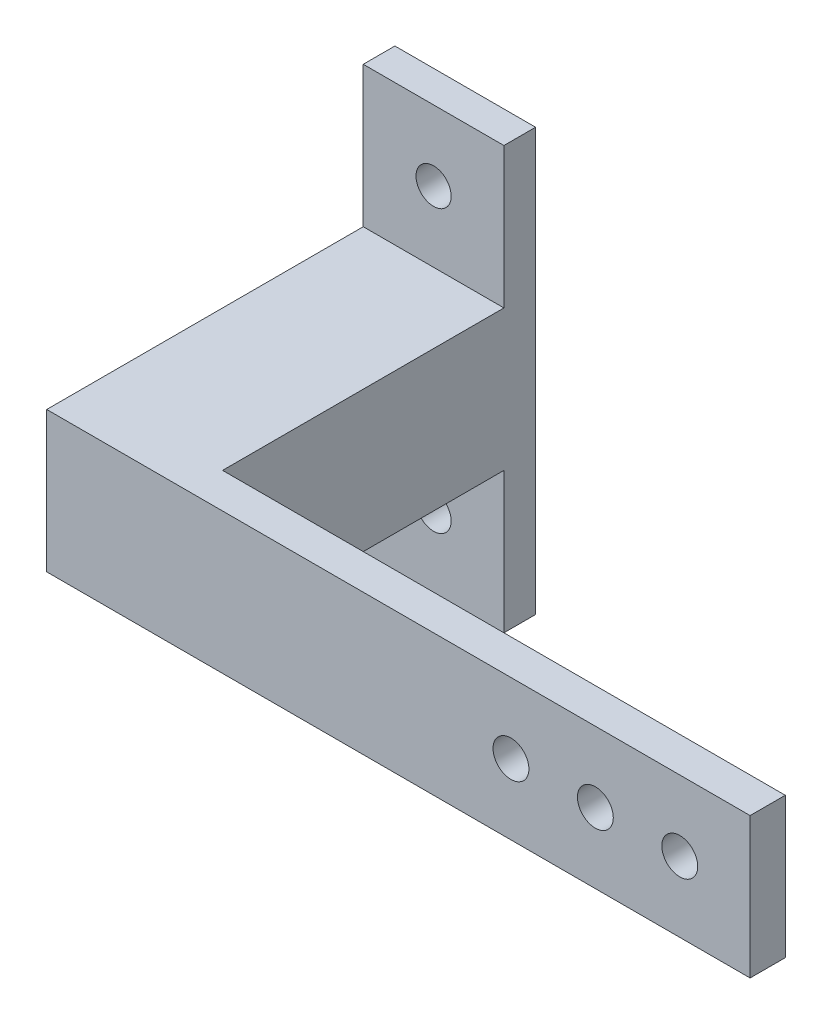
ISO-10303-21;
HEADER;
FILE_DESCRIPTION(('STEP AP214'),'2;1');
FILE_NAME('part.step','',(''),(''),'','','');
FILE_SCHEMA(('AUTOMOTIVE_DESIGN { 1 0 10303 214 1 1 1 1 }'));
ENDSEC;
DATA;
#1=APPLICATION_CONTEXT('core data for automotive mechanical design processes');
#2=APPLICATION_PROTOCOL_DEFINITION('international standard','automotive_design',2000,#1);
#3=PRODUCT_CONTEXT('',#1,'mechanical');
#4=PRODUCT('Part','Part','',(#3));
#5=PRODUCT_RELATED_PRODUCT_CATEGORY('part','',(#4));
#6=PRODUCT_DEFINITION_FORMATION('','',#4);
#7=PRODUCT_DEFINITION_CONTEXT('part definition',#1,'design');
#8=PRODUCT_DEFINITION('design','',#6,#7);
#9=PRODUCT_DEFINITION_SHAPE('','',#8);
#10=(LENGTH_UNIT() NAMED_UNIT(*) SI_UNIT(.MILLI.,.METRE.));
#11=(NAMED_UNIT(*) PLANE_ANGLE_UNIT() SI_UNIT($,.RADIAN.));
#12=(NAMED_UNIT(*) SI_UNIT($,.STERADIAN.) SOLID_ANGLE_UNIT());
#13=UNCERTAINTY_MEASURE_WITH_UNIT(LENGTH_MEASURE(1.E-05),#10,'distance_accuracy_value','');
#14=(GEOMETRIC_REPRESENTATION_CONTEXT(3) GLOBAL_UNCERTAINTY_ASSIGNED_CONTEXT((#13)) GLOBAL_UNIT_ASSIGNED_CONTEXT((#10,
#11,#12)) REPRESENTATION_CONTEXT('',''));
#15=CARTESIAN_POINT('',(0.,0.,0.));
#16=DIRECTION('',(0.,0.,1.));
#17=DIRECTION('',(1.,0.,0.));
#18=AXIS2_PLACEMENT_3D('',#15,#16,#17);
#19=CARTESIAN_POINT('',(0.,0.,4.5));
#20=DIRECTION('',(0.,0.,1.));
#21=DIRECTION('',(1.,0.,0.));
#22=AXIS2_PLACEMENT_3D('',#19,#20,#21);
#23=PLANE('',#22);
#24=CARTESIAN_POINT('',(0.,20.,4.5));
#25=DIRECTION('',(0.,0.,1.));
#26=DIRECTION('',(1.,0.,0.));
#27=AXIS2_PLACEMENT_3D('',#24,#25,#26);
#28=CIRCLE('',#27,2.5);
#29=CARTESIAN_POINT('',(2.5,20.,4.5));
#30=VERTEX_POINT('',#29);
#31=EDGE_CURVE('E234',#30,#30,#28,.T.);
#32=ORIENTED_EDGE('',*,*,#31,.F.);
#33=EDGE_LOOP('',(#32));
#34=FACE_BOUND('',#33,.T.);
#35=DIRECTION('',(-1.,0.,0.));
#36=VECTOR('',#35,1.);
#37=CARTESIAN_POINT('',(10.,10.,4.5));
#38=LINE('',#37,#36);
#39=CARTESIAN_POINT('',(9.99999999999999,9.99999999999999,4.5));
#40=VERTEX_POINT('',#39);
#41=CARTESIAN_POINT('',(-10.,9.99999999999999,4.5));
#42=VERTEX_POINT('',#41);
#43=EDGE_CURVE('E61',#40,#42,#38,.T.);
#44=ORIENTED_EDGE('',*,*,#43,.F.);
#45=DIRECTION('',(0.,1.,0.));
#46=VECTOR('',#45,1.);
#47=CARTESIAN_POINT('',(9.99999999999999,-30.,4.5));
#48=LINE('',#47,#46);
#49=CARTESIAN_POINT('',(9.99999999999999,30.,4.5));
#50=VERTEX_POINT('',#49);
#51=EDGE_CURVE('E201',#40,#50,#48,.T.);
#52=ORIENTED_EDGE('',*,*,#51,.T.);
#53=DIRECTION('',(-1.,0.,0.));
#54=VECTOR('',#53,1.);
#55=CARTESIAN_POINT('',(9.99999999999999,30.,4.5));
#56=LINE('',#55,#54);
#57=CARTESIAN_POINT('',(-10.,30.,4.5));
#58=VERTEX_POINT('',#57);
#59=EDGE_CURVE('E205',#50,#58,#56,.T.);
#60=ORIENTED_EDGE('',*,*,#59,.T.);
#61=DIRECTION('',(0.,-1.,0.));
#62=VECTOR('',#61,1.);
#63=CARTESIAN_POINT('',(-10.,-30.,4.5));
#64=LINE('',#63,#62);
#65=EDGE_CURVE('E195',#58,#42,#64,.T.);
#66=ORIENTED_EDGE('',*,*,#65,.T.);
#67=EDGE_LOOP('',(#44,#52,#60,#66));
#68=FACE_BOUND('',#67,.T.);
#69=ADVANCED_FACE('F43',(#34,#68),#23,.T.);
#70=CARTESIAN_POINT('',(-10.,-30.,4.5));
#71=DIRECTION('',(1.,0.,0.));
#72=DIRECTION('',(0.,0.,-1.));
#73=AXIS2_PLACEMENT_3D('',#70,#71,#72);
#74=PLANE('',#73);
#75=DIRECTION('',(0.,-1.,0.));
#76=VECTOR('',#75,1.);
#77=CARTESIAN_POINT('',(-10.,-30.,0.));
#78=LINE('',#77,#76);
#79=CARTESIAN_POINT('',(-10.,30.,0.));
#80=VERTEX_POINT('',#79);
#81=CARTESIAN_POINT('',(-10.,-30.,0.));
#82=VERTEX_POINT('',#81);
#83=EDGE_CURVE('E133',#80,#82,#78,.T.);
#84=ORIENTED_EDGE('',*,*,#83,.T.);
#85=DIRECTION('',(0.,0.,-1.));
#86=VECTOR('',#85,1.);
#87=CARTESIAN_POINT('',(-10.,-30.,4.5));
#88=LINE('',#87,#86);
#89=CARTESIAN_POINT('',(-10.,-30.,4.5));
#90=VERTEX_POINT('',#89);
#91=EDGE_CURVE('E11',#90,#82,#88,.T.);
#92=ORIENTED_EDGE('',*,*,#91,.F.);
#93=CARTESIAN_POINT('',(-10.,-10.,4.5));
#94=VERTEX_POINT('',#93);
#95=EDGE_CURVE('E130',#94,#90,#64,.T.);
#96=ORIENTED_EDGE('',*,*,#95,.F.);
#97=DIRECTION('',(0.,0.,-1.));
#98=VECTOR('',#97,1.);
#99=CARTESIAN_POINT('',(-10.,-10.,44.5));
#100=LINE('',#99,#98);
#101=CARTESIAN_POINT('',(-10.,-10.,49.5));
#102=VERTEX_POINT('',#101);
#103=EDGE_CURVE('E123',#102,#94,#100,.T.);
#104=ORIENTED_EDGE('',*,*,#103,.F.);
#105=DIRECTION('',(0.,-1.,0.));
#106=VECTOR('',#105,1.);
#107=CARTESIAN_POINT('',(-10.,-10.,49.5));
#108=LINE('',#107,#106);
#109=CARTESIAN_POINT('',(-10.,10.,49.5));
#110=VERTEX_POINT('',#109);
#111=EDGE_CURVE('E128',#110,#102,#108,.T.);
#112=ORIENTED_EDGE('',*,*,#111,.F.);
#113=DIRECTION('',(0.,0.,-1.));
#114=VECTOR('',#113,1.);
#115=CARTESIAN_POINT('',(-10.,10.,44.5));
#116=LINE('',#115,#114);
#117=EDGE_CURVE('E181',#110,#42,#116,.T.);
#118=ORIENTED_EDGE('',*,*,#117,.T.);
#119=ORIENTED_EDGE('',*,*,#65,.F.);
#120=DIRECTION('',(0.,0.,-1.));
#121=VECTOR('',#120,1.);
#122=CARTESIAN_POINT('',(-10.,30.,4.5));
#123=LINE('',#122,#121);
#124=EDGE_CURVE('E208',#58,#80,#123,.T.);
#125=ORIENTED_EDGE('',*,*,#124,.T.);
#126=EDGE_LOOP('',(#84,#92,#96,#104,#112,#118,#119,#125));
#127=FACE_BOUND('',#126,.T.);
#128=ADVANCED_FACE('F45',(#127),#74,.F.);
#129=CARTESIAN_POINT('',(9.99999999999999,-30.,4.5));
#130=DIRECTION('',(0.,1.,0.));
#131=DIRECTION('',(-1.,0.,0.));
#132=AXIS2_PLACEMENT_3D('',#129,#130,#131);
#133=PLANE('',#132);
#134=DIRECTION('',(1.,0.,0.));
#135=VECTOR('',#134,1.);
#136=CARTESIAN_POINT('',(9.99999999999999,-30.,0.));
#137=LINE('',#136,#135);
#138=CARTESIAN_POINT('',(9.99999999999999,-30.,0.));
#139=VERTEX_POINT('',#138);
#140=EDGE_CURVE('E211',#82,#139,#137,.T.);
#141=ORIENTED_EDGE('',*,*,#140,.T.);
#142=DIRECTION('',(0.,0.,-1.));
#143=VECTOR('',#142,1.);
#144=CARTESIAN_POINT('',(9.99999999999999,-30.,4.5));
#145=LINE('',#144,#143);
#146=CARTESIAN_POINT('',(9.99999999999999,-30.,4.5));
#147=VERTEX_POINT('',#146);
#148=EDGE_CURVE('E53',#147,#139,#145,.T.);
#149=ORIENTED_EDGE('',*,*,#148,.F.);
#150=DIRECTION('',(1.,0.,0.));
#151=VECTOR('',#150,1.);
#152=CARTESIAN_POINT('',(9.99999999999999,-30.,4.5));
#153=LINE('',#152,#151);
#154=EDGE_CURVE('E198',#90,#147,#153,.T.);
#155=ORIENTED_EDGE('',*,*,#154,.F.);
#156=ORIENTED_EDGE('',*,*,#91,.T.);
#157=EDGE_LOOP('',(#141,#149,#155,#156));
#158=FACE_BOUND('',#157,.T.);
#159=ADVANCED_FACE('F303',(#158),#133,.F.);
#160=CARTESIAN_POINT('',(9.99999999999999,-30.,4.5));
#161=DIRECTION('',(-1.,0.,0.));
#162=DIRECTION('',(0.,0.,1.));
#163=AXIS2_PLACEMENT_3D('',#160,#161,#162);
#164=PLANE('',#163);
#165=DIRECTION('',(0.,1.,0.));
#166=VECTOR('',#165,1.);
#167=CARTESIAN_POINT('',(9.99999999999999,-30.,0.));
#168=LINE('',#167,#166);
#169=CARTESIAN_POINT('',(9.99999999999999,30.,0.));
#170=VERTEX_POINT('',#169);
#171=EDGE_CURVE('E214',#139,#170,#168,.T.);
#172=ORIENTED_EDGE('',*,*,#171,.T.);
#173=DIRECTION('',(0.,0.,-1.));
#174=VECTOR('',#173,1.);
#175=CARTESIAN_POINT('',(9.99999999999999,30.,4.5));
#176=LINE('',#175,#174);
#177=EDGE_CURVE('E223',#50,#170,#176,.T.);
#178=ORIENTED_EDGE('',*,*,#177,.F.);
#179=ORIENTED_EDGE('',*,*,#51,.F.);
#180=DIRECTION('',(0.,0.,-1.));
#181=VECTOR('',#180,1.);
#182=CARTESIAN_POINT('',(10.,10.,44.5));
#183=LINE('',#182,#181);
#184=CARTESIAN_POINT('',(10.,10.,44.5));
#185=VERTEX_POINT('',#184);
#186=EDGE_CURVE('E188',#185,#40,#183,.T.);
#187=ORIENTED_EDGE('',*,*,#186,.F.);
#188=DIRECTION('',(0.,1.,0.));
#189=VECTOR('',#188,1.);
#190=CARTESIAN_POINT('',(10.,-10.,44.5));
#191=LINE('',#190,#189);
#192=CARTESIAN_POINT('',(10.,-10.,44.5));
#193=VERTEX_POINT('',#192);
#194=EDGE_CURVE('E177',#193,#185,#191,.T.);
#195=ORIENTED_EDGE('',*,*,#194,.F.);
#196=DIRECTION('',(0.,0.,-1.));
#197=VECTOR('',#196,1.);
#198=CARTESIAN_POINT('',(10.,-10.,44.5));
#199=LINE('',#198,#197);
#200=CARTESIAN_POINT('',(10.,-10.,4.5));
#201=VERTEX_POINT('',#200);
#202=EDGE_CURVE('E134',#193,#201,#199,.T.);
#203=ORIENTED_EDGE('',*,*,#202,.T.);
#204=EDGE_CURVE('E202',#147,#201,#48,.T.);
#205=ORIENTED_EDGE('',*,*,#204,.F.);
#206=ORIENTED_EDGE('',*,*,#148,.T.);
#207=EDGE_LOOP('',(#172,#178,#179,#187,#195,#203,#205,#206));
#208=FACE_BOUND('',#207,.T.);
#209=ADVANCED_FACE('F315',(#208),#164,.F.);
#210=CARTESIAN_POINT('',(9.99999999999999,30.,4.5));
#211=DIRECTION('',(0.,-1.,0.));
#212=DIRECTION('',(1.,0.,0.));
#213=AXIS2_PLACEMENT_3D('',#210,#211,#212);
#214=PLANE('',#213);
#215=DIRECTION('',(-1.,0.,0.));
#216=VECTOR('',#215,1.);
#217=CARTESIAN_POINT('',(9.99999999999999,30.,0.));
#218=LINE('',#217,#216);
#219=EDGE_CURVE('E217',#170,#80,#218,.T.);
#220=ORIENTED_EDGE('',*,*,#219,.T.);
#221=ORIENTED_EDGE('',*,*,#124,.F.);
#222=ORIENTED_EDGE('',*,*,#59,.F.);
#223=ORIENTED_EDGE('',*,*,#177,.T.);
#224=EDGE_LOOP('',(#220,#221,#222,#223));
#225=FACE_BOUND('',#224,.T.);
#226=ADVANCED_FACE('F308',(#225),#214,.F.);
#227=CARTESIAN_POINT('',(0.,-20.,4.5));
#228=DIRECTION('',(0.,0.,1.));
#229=DIRECTION('',(1.,0.,0.));
#230=AXIS2_PLACEMENT_3D('',#227,#228,#229);
#231=CIRCLE('',#230,2.5);
#232=CARTESIAN_POINT('',(2.5,-20.,4.5));
#233=VERTEX_POINT('',#232);
#234=EDGE_CURVE('E158',#233,#233,#231,.T.);
#235=ORIENTED_EDGE('',*,*,#234,.F.);
#236=EDGE_LOOP('',(#235));
#237=FACE_BOUND('',#236,.T.);
#238=DIRECTION('',(1.,0.,0.));
#239=VECTOR('',#238,1.);
#240=CARTESIAN_POINT('',(10.,-10.,4.5));
#241=LINE('',#240,#239);
#242=EDGE_CURVE('E69',#94,#201,#241,.T.);
#243=ORIENTED_EDGE('',*,*,#242,.F.);
#244=ORIENTED_EDGE('',*,*,#95,.T.);
#245=ORIENTED_EDGE('',*,*,#154,.T.);
#246=ORIENTED_EDGE('',*,*,#204,.T.);
#247=EDGE_LOOP('',(#243,#244,#245,#246));
#248=FACE_BOUND('',#247,.T.);
#249=ADVANCED_FACE('F299',(#237,#248),#23,.T.);
#250=CARTESIAN_POINT('',(0.,0.,0.));
#251=DIRECTION('',(0.,0.,1.));
#252=DIRECTION('',(1.,0.,0.));
#253=AXIS2_PLACEMENT_3D('',#250,#251,#252);
#254=PLANE('',#253);
#255=CARTESIAN_POINT('',(0.,20.,0.));
#256=DIRECTION('',(0.,0.,1.));
#257=DIRECTION('',(1.,0.,0.));
#258=AXIS2_PLACEMENT_3D('',#255,#256,#257);
#259=CIRCLE('',#258,2.5);
#260=CARTESIAN_POINT('',(2.5,20.,0.));
#261=VERTEX_POINT('',#260);
#262=EDGE_CURVE('E169',#261,#261,#259,.T.);
#263=ORIENTED_EDGE('',*,*,#262,.T.);
#264=EDGE_LOOP('',(#263));
#265=FACE_BOUND('',#264,.T.);
#266=CARTESIAN_POINT('',(0.,-20.,0.));
#267=DIRECTION('',(0.,0.,1.));
#268=DIRECTION('',(1.,0.,0.));
#269=AXIS2_PLACEMENT_3D('',#266,#267,#268);
#270=CIRCLE('',#269,2.5);
#271=CARTESIAN_POINT('',(2.5,-20.,0.));
#272=VERTEX_POINT('',#271);
#273=EDGE_CURVE('E230',#272,#272,#270,.T.);
#274=ORIENTED_EDGE('',*,*,#273,.T.);
#275=EDGE_LOOP('',(#274));
#276=FACE_BOUND('',#275,.T.);
#277=ORIENTED_EDGE('',*,*,#83,.F.);
#278=ORIENTED_EDGE('',*,*,#219,.F.);
#279=ORIENTED_EDGE('',*,*,#171,.F.);
#280=ORIENTED_EDGE('',*,*,#140,.F.);
#281=EDGE_LOOP('',(#277,#278,#279,#280));
#282=FACE_BOUND('',#281,.T.);
#283=ADVANCED_FACE('F307',(#265,#276,#282),#254,.F.);
#284=CARTESIAN_POINT('',(10.,-10.,44.5));
#285=DIRECTION('',(0.,1.,0.));
#286=DIRECTION('',(0.,0.,1.));
#287=AXIS2_PLACEMENT_3D('',#284,#285,#286);
#288=PLANE('',#287);
#289=ORIENTED_EDGE('',*,*,#242,.T.);
#290=ORIENTED_EDGE('',*,*,#202,.F.);
#291=DIRECTION('',(1.,0.,0.));
#292=VECTOR('',#291,1.);
#293=CARTESIAN_POINT('',(-10.,-10.,44.5));
#294=LINE('',#293,#292);
#295=CARTESIAN_POINT('',(90.,-10.,44.5));
#296=VERTEX_POINT('',#295);
#297=EDGE_CURVE('E166',#193,#296,#294,.T.);
#298=ORIENTED_EDGE('',*,*,#297,.T.);
#299=DIRECTION('',(0.,0.,-1.));
#300=VECTOR('',#299,1.);
#301=CARTESIAN_POINT('',(90.,-10.,49.5));
#302=LINE('',#301,#300);
#303=CARTESIAN_POINT('',(90.,-10.,49.5));
#304=VERTEX_POINT('',#303);
#305=EDGE_CURVE('E140',#304,#296,#302,.T.);
#306=ORIENTED_EDGE('',*,*,#305,.F.);
#307=DIRECTION('',(1.,0.,0.));
#308=VECTOR('',#307,1.);
#309=CARTESIAN_POINT('',(-10.,-10.,49.5));
#310=LINE('',#309,#308);
#311=EDGE_CURVE('E137',#102,#304,#310,.T.);
#312=ORIENTED_EDGE('',*,*,#311,.F.);
#313=ORIENTED_EDGE('',*,*,#103,.T.);
#314=EDGE_LOOP('',(#289,#290,#298,#306,#312,#313));
#315=FACE_BOUND('',#314,.T.);
#316=ADVANCED_FACE('F138',(#315),#288,.F.);
#317=CARTESIAN_POINT('',(10.,10.,44.5));
#318=DIRECTION('',(0.,-1.,0.));
#319=DIRECTION('',(0.,0.,-1.));
#320=AXIS2_PLACEMENT_3D('',#317,#318,#319);
#321=PLANE('',#320);
#322=ORIENTED_EDGE('',*,*,#43,.T.);
#323=ORIENTED_EDGE('',*,*,#117,.F.);
#324=DIRECTION('',(-1.,0.,0.));
#325=VECTOR('',#324,1.);
#326=CARTESIAN_POINT('',(-10.,10.,49.5));
#327=LINE('',#326,#325);
#328=CARTESIAN_POINT('',(90.,10.,49.5));
#329=VERTEX_POINT('',#328);
#330=EDGE_CURVE('E149',#329,#110,#327,.T.);
#331=ORIENTED_EDGE('',*,*,#330,.F.);
#332=DIRECTION('',(0.,0.,-1.));
#333=VECTOR('',#332,1.);
#334=CARTESIAN_POINT('',(90.,10.,49.5));
#335=LINE('',#334,#333);
#336=CARTESIAN_POINT('',(90.,10.,44.5));
#337=VERTEX_POINT('',#336);
#338=EDGE_CURVE('E165',#329,#337,#335,.T.);
#339=ORIENTED_EDGE('',*,*,#338,.T.);
#340=DIRECTION('',(-1.,0.,0.));
#341=VECTOR('',#340,1.);
#342=CARTESIAN_POINT('',(-10.,10.,44.5));
#343=LINE('',#342,#341);
#344=EDGE_CURVE('E151',#337,#185,#343,.T.);
#345=ORIENTED_EDGE('',*,*,#344,.T.);
#346=ORIENTED_EDGE('',*,*,#186,.T.);
#347=EDGE_LOOP('',(#322,#323,#331,#339,#345,#346));
#348=FACE_BOUND('',#347,.T.);
#349=ADVANCED_FACE('F339',(#348),#321,.F.);
#350=CARTESIAN_POINT('',(90.,-10.,49.5));
#351=DIRECTION('',(-1.,0.,0.));
#352=DIRECTION('',(0.,0.,1.));
#353=AXIS2_PLACEMENT_3D('',#350,#351,#352);
#354=PLANE('',#353);
#355=DIRECTION('',(0.,1.,0.));
#356=VECTOR('',#355,1.);
#357=CARTESIAN_POINT('',(90.,-10.,44.5));
#358=LINE('',#357,#356);
#359=EDGE_CURVE('E155',#296,#337,#358,.T.);
#360=ORIENTED_EDGE('',*,*,#359,.T.);
#361=ORIENTED_EDGE('',*,*,#338,.F.);
#362=DIRECTION('',(0.,1.,0.));
#363=VECTOR('',#362,1.);
#364=CARTESIAN_POINT('',(90.,-10.,49.5));
#365=LINE('',#364,#363);
#366=EDGE_CURVE('E144',#304,#329,#365,.T.);
#367=ORIENTED_EDGE('',*,*,#366,.F.);
#368=ORIENTED_EDGE('',*,*,#305,.T.);
#369=EDGE_LOOP('',(#360,#361,#367,#368));
#370=FACE_BOUND('',#369,.T.);
#371=ADVANCED_FACE('F277',(#370),#354,.F.);
#372=CARTESIAN_POINT('',(0.,0.,49.5));
#373=DIRECTION('',(0.,0.,-1.));
#374=DIRECTION('',(-1.,0.,0.));
#375=AXIS2_PLACEMENT_3D('',#372,#373,#374);
#376=PLANE('',#375);
#377=CARTESIAN_POINT('',(80.,0.,49.5));
#378=DIRECTION('',(0.,0.,1.));
#379=DIRECTION('',(1.,0.,0.));
#380=AXIS2_PLACEMENT_3D('',#377,#378,#379);
#381=CIRCLE('',#380,2.54999999999999);
#382=CARTESIAN_POINT('',(82.55,0.,49.5));
#383=VERTEX_POINT('',#382);
#384=EDGE_CURVE('E242',#383,#383,#381,.T.);
#385=ORIENTED_EDGE('',*,*,#384,.F.);
#386=EDGE_LOOP('',(#385));
#387=FACE_BOUND('',#386,.T.);
#388=CARTESIAN_POINT('',(68.,0.,49.5));
#389=DIRECTION('',(0.,0.,1.));
#390=DIRECTION('',(1.,0.,0.));
#391=AXIS2_PLACEMENT_3D('',#388,#389,#390);
#392=CIRCLE('',#391,2.54999999999999);
#393=CARTESIAN_POINT('',(70.55,0.,49.5));
#394=VERTEX_POINT('',#393);
#395=EDGE_CURVE('E264',#394,#394,#392,.T.);
#396=ORIENTED_EDGE('',*,*,#395,.F.);
#397=EDGE_LOOP('',(#396));
#398=FACE_BOUND('',#397,.T.);
#399=CARTESIAN_POINT('',(56.,-1.6759110426447E-13,49.5));
#400=DIRECTION('',(0.,0.,1.));
#401=DIRECTION('',(1.,0.,0.));
#402=AXIS2_PLACEMENT_3D('',#399,#400,#401);
#403=CIRCLE('',#402,2.54999999999999);
#404=CARTESIAN_POINT('',(58.55,-1.6759110426447E-13,49.5));
#405=VERTEX_POINT('',#404);
#406=EDGE_CURVE('E260',#405,#405,#403,.T.);
#407=ORIENTED_EDGE('',*,*,#406,.F.);
#408=EDGE_LOOP('',(#407));
#409=FACE_BOUND('',#408,.T.);
#410=ORIENTED_EDGE('',*,*,#111,.T.);
#411=ORIENTED_EDGE('',*,*,#311,.T.);
#412=ORIENTED_EDGE('',*,*,#366,.T.);
#413=ORIENTED_EDGE('',*,*,#330,.T.);
#414=EDGE_LOOP('',(#410,#411,#412,#413));
#415=FACE_BOUND('',#414,.T.);
#416=ADVANCED_FACE('F147',(#387,#398,#409,#415),#376,.F.);
#417=CARTESIAN_POINT('',(0.,0.,44.5));
#418=DIRECTION('',(0.,0.,-1.));
#419=DIRECTION('',(-1.,0.,0.));
#420=AXIS2_PLACEMENT_3D('',#417,#418,#419);
#421=PLANE('',#420);
#422=CARTESIAN_POINT('',(80.,0.,44.5));
#423=DIRECTION('',(0.,0.,-1.));
#424=DIRECTION('',(-1.,0.,0.));
#425=AXIS2_PLACEMENT_3D('',#422,#423,#424);
#426=CIRCLE('',#425,2.54999999999999);
#427=CARTESIAN_POINT('',(77.45,0.,44.5));
#428=VERTEX_POINT('',#427);
#429=EDGE_CURVE('E47',#428,#428,#426,.T.);
#430=ORIENTED_EDGE('',*,*,#429,.F.);
#431=EDGE_LOOP('',(#430));
#432=FACE_BOUND('',#431,.T.);
#433=CARTESIAN_POINT('',(68.,0.,44.5));
#434=DIRECTION('',(0.,0.,-1.));
#435=DIRECTION('',(-1.,0.,0.));
#436=AXIS2_PLACEMENT_3D('',#433,#434,#435);
#437=CIRCLE('',#436,2.54999999999999);
#438=CARTESIAN_POINT('',(65.45,0.,44.5));
#439=VERTEX_POINT('',#438);
#440=EDGE_CURVE('E241',#439,#439,#437,.T.);
#441=ORIENTED_EDGE('',*,*,#440,.F.);
#442=EDGE_LOOP('',(#441));
#443=FACE_BOUND('',#442,.T.);
#444=CARTESIAN_POINT('',(56.,-1.6759110426447E-13,44.5));
#445=DIRECTION('',(0.,0.,-1.));
#446=DIRECTION('',(-1.,0.,0.));
#447=AXIS2_PLACEMENT_3D('',#444,#445,#446);
#448=CIRCLE('',#447,2.54999999999999);
#449=CARTESIAN_POINT('',(53.45,-1.6759110426447E-13,44.5));
#450=VERTEX_POINT('',#449);
#451=EDGE_CURVE('E238',#450,#450,#448,.T.);
#452=ORIENTED_EDGE('',*,*,#451,.F.);
#453=EDGE_LOOP('',(#452));
#454=FACE_BOUND('',#453,.T.);
#455=ORIENTED_EDGE('',*,*,#297,.F.);
#456=ORIENTED_EDGE('',*,*,#194,.T.);
#457=ORIENTED_EDGE('',*,*,#344,.F.);
#458=ORIENTED_EDGE('',*,*,#359,.F.);
#459=EDGE_LOOP('',(#455,#456,#457,#458));
#460=FACE_BOUND('',#459,.T.);
#461=ADVANCED_FACE('F276',(#432,#443,#454,#460),#421,.T.);
#462=CARTESIAN_POINT('',(0.,-20.,-0.5));
#463=DIRECTION('',(0.,0.,1.));
#464=DIRECTION('',(1.,0.,0.));
#465=AXIS2_PLACEMENT_3D('',#462,#463,#464);
#466=CYLINDRICAL_SURFACE('',#465,2.5);
#467=ORIENTED_EDGE('',*,*,#234,.T.);
#468=EDGE_LOOP('',(#467));
#469=FACE_BOUND('',#468,.T.);
#470=ORIENTED_EDGE('',*,*,#273,.F.);
#471=EDGE_LOOP('',(#470));
#472=FACE_BOUND('',#471,.T.);
#473=ADVANCED_FACE('F294',(#469,#472),#466,.F.);
#474=CARTESIAN_POINT('',(0.,20.,-0.5));
#475=DIRECTION('',(0.,0.,1.));
#476=DIRECTION('',(1.,0.,0.));
#477=AXIS2_PLACEMENT_3D('',#474,#475,#476);
#478=CYLINDRICAL_SURFACE('',#477,2.5);
#479=ORIENTED_EDGE('',*,*,#31,.T.);
#480=EDGE_LOOP('',(#479));
#481=FACE_BOUND('',#480,.T.);
#482=ORIENTED_EDGE('',*,*,#262,.F.);
#483=EDGE_LOOP('',(#482));
#484=FACE_BOUND('',#483,.T.);
#485=ADVANCED_FACE('F286',(#481,#484),#478,.F.);
#486=CARTESIAN_POINT('',(56.,-1.6759110426447E-13,39.5));
#487=DIRECTION('',(0.,0.,1.));
#488=DIRECTION('',(1.,0.,0.));
#489=AXIS2_PLACEMENT_3D('',#486,#487,#488);
#490=CYLINDRICAL_SURFACE('',#489,2.54999999999999);
#491=ORIENTED_EDGE('',*,*,#451,.T.);
#492=EDGE_LOOP('',(#491));
#493=FACE_BOUND('',#492,.T.);
#494=ORIENTED_EDGE('',*,*,#406,.T.);
#495=EDGE_LOOP('',(#494));
#496=FACE_BOUND('',#495,.T.);
#497=ADVANCED_FACE('F283',(#493,#496),#490,.F.);
#498=CARTESIAN_POINT('',(68.,0.,39.5));
#499=DIRECTION('',(0.,0.,1.));
#500=DIRECTION('',(1.,0.,0.));
#501=AXIS2_PLACEMENT_3D('',#498,#499,#500);
#502=CYLINDRICAL_SURFACE('',#501,2.54999999999999);
#503=ORIENTED_EDGE('',*,*,#440,.T.);
#504=EDGE_LOOP('',(#503));
#505=FACE_BOUND('',#504,.T.);
#506=ORIENTED_EDGE('',*,*,#395,.T.);
#507=EDGE_LOOP('',(#506));
#508=FACE_BOUND('',#507,.T.);
#509=ADVANCED_FACE('F285',(#505,#508),#502,.F.);
#510=CARTESIAN_POINT('',(80.,0.,39.5));
#511=DIRECTION('',(0.,0.,1.));
#512=DIRECTION('',(1.,0.,0.));
#513=AXIS2_PLACEMENT_3D('',#510,#511,#512);
#514=CYLINDRICAL_SURFACE('',#513,2.54999999999999);
#515=ORIENTED_EDGE('',*,*,#429,.T.);
#516=EDGE_LOOP('',(#515));
#517=FACE_BOUND('',#516,.T.);
#518=ORIENTED_EDGE('',*,*,#384,.T.);
#519=EDGE_LOOP('',(#518));
#520=FACE_BOUND('',#519,.T.);
#521=ADVANCED_FACE('F272',(#517,#520),#514,.F.);
#522=CLOSED_SHELL('',(#69,#128,#159,#209,#226,#249,#283,#316,#349,#371,#416,#461,#473,#485,#497,
#509,#521));
#523=MANIFOLD_SOLID_BREP('B2',#522);
#524=ADVANCED_BREP_SHAPE_REPRESENTATION('',(#18,#523),#14);
#525=SHAPE_DEFINITION_REPRESENTATION(#9,#524);
ENDSEC;
END-ISO-10303-21;
